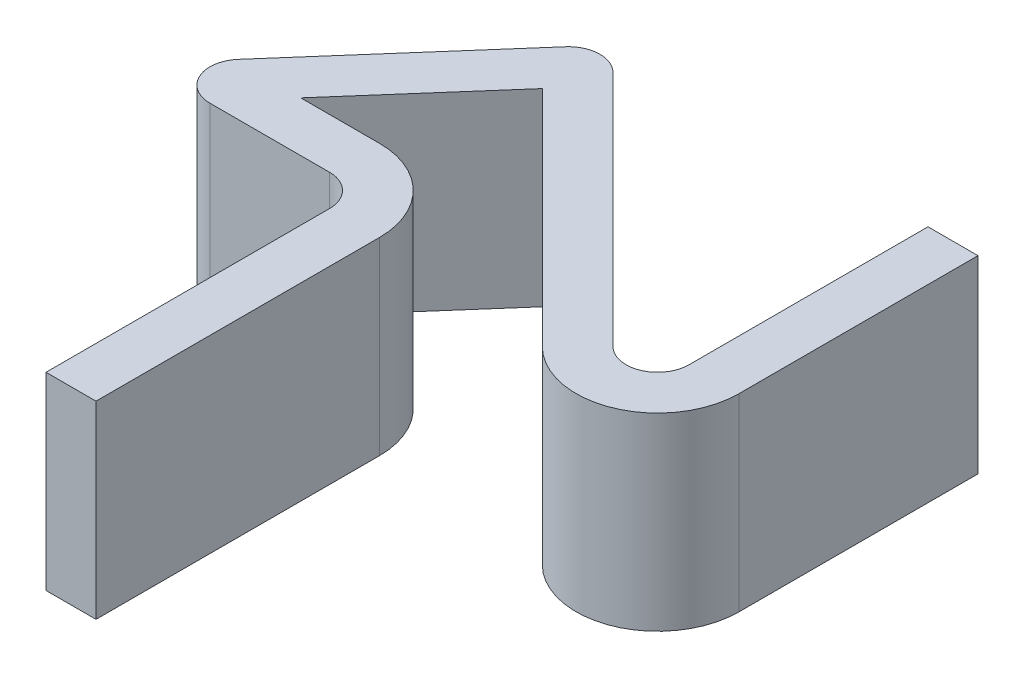
ISO-10303-21;
HEADER;
FILE_DESCRIPTION(('STEP AP214'),'2;1');
FILE_NAME('part.step','',(''),(''),'','','');
FILE_SCHEMA(('AUTOMOTIVE_DESIGN { 1 0 10303 214 1 1 1 1 }'));
ENDSEC;
DATA;
#1=APPLICATION_CONTEXT('core data for automotive mechanical design processes');
#2=APPLICATION_PROTOCOL_DEFINITION('international standard','automotive_design',2000,#1);
#3=PRODUCT_CONTEXT('',#1,'mechanical');
#4=PRODUCT('Part','Part','',(#3));
#5=PRODUCT_RELATED_PRODUCT_CATEGORY('part','',(#4));
#6=PRODUCT_DEFINITION_FORMATION('','',#4);
#7=PRODUCT_DEFINITION_CONTEXT('part definition',#1,'design');
#8=PRODUCT_DEFINITION('design','',#6,#7);
#9=PRODUCT_DEFINITION_SHAPE('','',#8);
#10=(LENGTH_UNIT() NAMED_UNIT(*) SI_UNIT(.MILLI.,.METRE.));
#11=(NAMED_UNIT(*) PLANE_ANGLE_UNIT() SI_UNIT($,.RADIAN.));
#12=(NAMED_UNIT(*) SI_UNIT($,.STERADIAN.) SOLID_ANGLE_UNIT());
#13=UNCERTAINTY_MEASURE_WITH_UNIT(LENGTH_MEASURE(1.E-05),#10,'distance_accuracy_value','');
#14=(GEOMETRIC_REPRESENTATION_CONTEXT(3) GLOBAL_UNCERTAINTY_ASSIGNED_CONTEXT((#13)) GLOBAL_UNIT_ASSIGNED_CONTEXT((#10,
#11,#12)) REPRESENTATION_CONTEXT('',''));
#15=CARTESIAN_POINT('',(0.,0.,0.));
#16=DIRECTION('',(0.,0.,1.));
#17=DIRECTION('',(1.,0.,0.));
#18=AXIS2_PLACEMENT_3D('',#15,#16,#17);
#19=CARTESIAN_POINT('',(0.,1.5,0.));
#20=DIRECTION('',(0.,0.,-1.));
#21=DIRECTION('',(-1.,0.,0.));
#22=AXIS2_PLACEMENT_3D('',#19,#20,#21);
#23=PLANE('',#22);
#24=DIRECTION('',(1.,0.,0.));
#25=VECTOR('',#24,1.);
#26=CARTESIAN_POINT('',(0.,-1.5,0.));
#27=LINE('',#26,#25);
#28=CARTESIAN_POINT('',(0.,-1.5,0.));
#29=VERTEX_POINT('',#28);
#30=CARTESIAN_POINT('',(0.79375,-1.5,0.));
#31=VERTEX_POINT('',#30);
#32=EDGE_CURVE('E200',#29,#31,#27,.T.);
#33=ORIENTED_EDGE('',*,*,#32,.T.);
#34=DIRECTION('',(0.,-1.,0.));
#35=VECTOR('',#34,1.);
#36=CARTESIAN_POINT('',(0.79375,1.5,0.));
#37=LINE('',#36,#35);
#38=CARTESIAN_POINT('',(0.79375,1.5,0.));
#39=VERTEX_POINT('',#38);
#40=EDGE_CURVE('E11',#39,#31,#37,.T.);
#41=ORIENTED_EDGE('',*,*,#40,.F.);
#42=DIRECTION('',(1.,0.,0.));
#43=VECTOR('',#42,1.);
#44=CARTESIAN_POINT('',(0.,1.5,0.));
#45=LINE('',#44,#43);
#46=CARTESIAN_POINT('',(0.,1.5,0.));
#47=VERTEX_POINT('',#46);
#48=EDGE_CURVE('E252',#47,#39,#45,.T.);
#49=ORIENTED_EDGE('',*,*,#48,.F.);
#50=DIRECTION('',(0.,-1.,0.));
#51=VECTOR('',#50,1.);
#52=CARTESIAN_POINT('',(0.,1.5,0.));
#53=LINE('',#52,#51);
#54=EDGE_CURVE('E196',#47,#29,#53,.T.);
#55=ORIENTED_EDGE('',*,*,#54,.T.);
#56=EDGE_LOOP('',(#33,#41,#49,#55));
#57=FACE_BOUND('',#56,.T.);
#58=ADVANCED_FACE('F39',(#57),#23,.F.);
#59=CARTESIAN_POINT('',(0.79375,1.5,0.));
#60=DIRECTION('',(-1.,0.,0.));
#61=DIRECTION('',(0.,0.,1.));
#62=AXIS2_PLACEMENT_3D('',#59,#60,#61);
#63=PLANE('',#62);
#64=DIRECTION('',(0.,0.,-1.));
#65=VECTOR('',#64,1.);
#66=CARTESIAN_POINT('',(0.79375,-1.5,0.));
#67=LINE('',#66,#65);
#68=CARTESIAN_POINT('',(0.793750000000001,-1.5,-4.5));
#69=VERTEX_POINT('',#68);
#70=EDGE_CURVE('E204',#31,#69,#67,.T.);
#71=ORIENTED_EDGE('',*,*,#70,.T.);
#72=DIRECTION('',(0.,-1.,0.));
#73=VECTOR('',#72,1.);
#74=CARTESIAN_POINT('',(0.793750000000001,1.5,-4.5));
#75=LINE('',#74,#73);
#76=CARTESIAN_POINT('',(0.793750000000001,1.5,-4.5));
#77=VERTEX_POINT('',#76);
#78=EDGE_CURVE('E48',#77,#69,#75,.T.);
#79=ORIENTED_EDGE('',*,*,#78,.F.);
#80=DIRECTION('',(0.,0.,-1.));
#81=VECTOR('',#80,1.);
#82=CARTESIAN_POINT('',(0.79375,1.5,0.));
#83=LINE('',#82,#81);
#84=EDGE_CURVE('E129',#39,#77,#83,.T.);
#85=ORIENTED_EDGE('',*,*,#84,.F.);
#86=ORIENTED_EDGE('',*,*,#40,.T.);
#87=EDGE_LOOP('',(#71,#79,#85,#86));
#88=FACE_BOUND('',#87,.T.);
#89=ADVANCED_FACE('F388',(#88),#63,.F.);
#90=CARTESIAN_POINT('',(-0.5,1.5,-4.5));
#91=DIRECTION('',(0.,-1.,0.));
#92=DIRECTION('',(0.,0.,-1.));
#93=AXIS2_PLACEMENT_3D('',#90,#91,#92);
#94=CYLINDRICAL_SURFACE('',#93,1.29375);
#95=CARTESIAN_POINT('',(-0.5,-1.5,-4.5));
#96=DIRECTION('',(0.,1.,0.));
#97=DIRECTION('',(0.,0.,1.));
#98=AXIS2_PLACEMENT_3D('',#95,#96,#97);
#99=CIRCLE('',#98,1.29375);
#100=CARTESIAN_POINT('',(-0.5,-1.5,-5.79375));
#101=VERTEX_POINT('',#100);
#102=EDGE_CURVE('E207',#69,#101,#99,.T.);
#103=ORIENTED_EDGE('',*,*,#102,.T.);
#104=DIRECTION('',(0.,-1.,0.));
#105=VECTOR('',#104,1.);
#106=CARTESIAN_POINT('',(-0.5,1.5,-5.79375));
#107=LINE('',#106,#105);
#108=CARTESIAN_POINT('',(-0.5,1.5,-5.79375));
#109=VERTEX_POINT('',#108);
#110=EDGE_CURVE('E303',#109,#101,#107,.T.);
#111=ORIENTED_EDGE('',*,*,#110,.F.);
#112=CARTESIAN_POINT('',(-0.5,1.5,-4.5));
#113=DIRECTION('',(0.,1.,0.));
#114=DIRECTION('',(0.,0.,1.));
#115=AXIS2_PLACEMENT_3D('',#112,#113,#114);
#116=CIRCLE('',#115,1.29375);
#117=EDGE_CURVE('E313',#77,#109,#116,.T.);
#118=ORIENTED_EDGE('',*,*,#117,.F.);
#119=ORIENTED_EDGE('',*,*,#78,.T.);
#120=EDGE_LOOP('',(#103,#111,#118,#119));
#121=FACE_BOUND('',#120,.T.);
#122=ADVANCED_FACE('F311',(#121),#94,.T.);
#123=CARTESIAN_POINT('',(-0.5,1.5,-5.79375));
#124=DIRECTION('',(0.,0.,1.));
#125=DIRECTION('',(1.,0.,0.));
#126=AXIS2_PLACEMENT_3D('',#123,#124,#125);
#127=PLANE('',#126);
#128=DIRECTION('',(-1.,0.,0.));
#129=VECTOR('',#128,1.);
#130=CARTESIAN_POINT('',(-0.5,-1.5,-5.79375));
#131=LINE('',#130,#129);
#132=CARTESIAN_POINT('',(-1.75075897014273,-1.5,-5.79375));
#133=VERTEX_POINT('',#132);
#134=EDGE_CURVE('E210',#101,#133,#131,.T.);
#135=ORIENTED_EDGE('',*,*,#134,.T.);
#136=DIRECTION('',(0.,-1.,0.));
#137=VECTOR('',#136,1.);
#138=CARTESIAN_POINT('',(-1.75075897014273,1.5,-5.79375));
#139=LINE('',#138,#137);
#140=CARTESIAN_POINT('',(-1.75075897014273,1.5,-5.79375));
#141=VERTEX_POINT('',#140);
#142=EDGE_CURVE('E299',#141,#133,#139,.T.);
#143=ORIENTED_EDGE('',*,*,#142,.F.);
#144=DIRECTION('',(-1.,0.,0.));
#145=VECTOR('',#144,1.);
#146=CARTESIAN_POINT('',(-0.5,1.5,-5.79375));
#147=LINE('',#146,#145);
#148=EDGE_CURVE('E332',#109,#141,#147,.T.);
#149=ORIENTED_EDGE('',*,*,#148,.F.);
#150=ORIENTED_EDGE('',*,*,#110,.T.);
#151=EDGE_LOOP('',(#135,#143,#149,#150));
#152=FACE_BOUND('',#151,.T.);
#153=ADVANCED_FACE('F322',(#152),#127,.F.);
#154=CARTESIAN_POINT('',(-1.75075897014273,1.5,-5.79375));
#155=DIRECTION('',(-0.752576694706878,0.,-0.658504607868518));
#156=DIRECTION('',(-0.658504607868518,0.,0.752576694706878));
#157=AXIS2_PLACEMENT_3D('',#154,#155,#156);
#158=PLANE('',#157);
#159=DIRECTION('',(0.658504607868518,0.,-0.752576694706878));
#160=VECTOR('',#159,1.);
#161=CARTESIAN_POINT('',(-1.75075897014273,-1.5,-5.79375));
#162=LINE('',#161,#160);
#163=CARTESIAN_POINT('',(0.0386636088615076,-1.5,-7.83880437600485));
#164=VERTEX_POINT('',#163);
#165=EDGE_CURVE('E213',#133,#164,#162,.T.);
#166=ORIENTED_EDGE('',*,*,#165,.T.);
#167=DIRECTION('',(0.,-1.,0.));
#168=VECTOR('',#167,1.);
#169=CARTESIAN_POINT('',(0.0386636088615076,1.5,-7.83880437600485));
#170=LINE('',#169,#168);
#171=CARTESIAN_POINT('',(0.0386636088615076,1.5,-7.83880437600485));
#172=VERTEX_POINT('',#171);
#173=EDGE_CURVE('E295',#172,#164,#170,.T.);
#174=ORIENTED_EDGE('',*,*,#173,.F.);
#175=DIRECTION('',(0.658504607868518,0.,-0.752576694706878));
#176=VECTOR('',#175,1.);
#177=CARTESIAN_POINT('',(-1.75075897014273,1.5,-5.79375));
#178=LINE('',#177,#176);
#179=EDGE_CURVE('E328',#141,#172,#178,.T.);
#180=ORIENTED_EDGE('',*,*,#179,.F.);
#181=ORIENTED_EDGE('',*,*,#142,.T.);
#182=EDGE_LOOP('',(#166,#174,#180,#181));
#183=FACE_BOUND('',#182,.T.);
#184=ADVANCED_FACE('F326',(#183),#158,.F.);
#185=CARTESIAN_POINT('',(0.0386636088615076,1.5,-7.83880437600485));
#186=DIRECTION('',(0.707106781186548,0.,-0.707106781186547));
#187=DIRECTION('',(-0.707106781186547,0.,-0.707106781186548));
#188=AXIS2_PLACEMENT_3D('',#185,#186,#187);
#189=PLANE('',#188);
#190=DIRECTION('',(0.707106781186547,0.,0.707106781186548));
#191=VECTOR('',#190,1.);
#192=CARTESIAN_POINT('',(0.0386636088615076,-1.5,-7.83880437600485));
#193=LINE('',#192,#191);
#194=CARTESIAN_POINT('',(3.5851806018399,-1.5,-4.29228738302645));
#195=VERTEX_POINT('',#194);
#196=EDGE_CURVE('E216',#164,#195,#193,.T.);
#197=ORIENTED_EDGE('',*,*,#196,.T.);
#198=DIRECTION('',(0.,-1.,0.));
#199=VECTOR('',#198,1.);
#200=CARTESIAN_POINT('',(3.5851806018399,1.5,-4.29228738302645));
#201=LINE('',#200,#199);
#202=CARTESIAN_POINT('',(3.5851806018399,1.5,-4.29228738302645));
#203=VERTEX_POINT('',#202);
#204=EDGE_CURVE('E291',#203,#195,#201,.T.);
#205=ORIENTED_EDGE('',*,*,#204,.F.);
#206=DIRECTION('',(0.707106781186547,0.,0.707106781186548));
#207=VECTOR('',#206,1.);
#208=CARTESIAN_POINT('',(0.0386636088615076,1.5,-7.83880437600485));
#209=LINE('',#208,#207);
#210=EDGE_CURVE('E331',#172,#203,#209,.T.);
#211=ORIENTED_EDGE('',*,*,#210,.F.);
#212=ORIENTED_EDGE('',*,*,#173,.T.);
#213=EDGE_LOOP('',(#197,#205,#211,#212));
#214=FACE_BOUND('',#213,.T.);
#215=ADVANCED_FACE('F401',(#214),#189,.F.);
#216=CARTESIAN_POINT('',(4.5,1.5,-5.20710678118655));
#217=DIRECTION('',(0.,-1.,0.));
#218=DIRECTION('',(0.,0.,-1.));
#219=AXIS2_PLACEMENT_3D('',#216,#217,#218);
#220=CYLINDRICAL_SURFACE('',#219,1.29375);
#221=CARTESIAN_POINT('',(4.5,-1.5,-5.20710678118655));
#222=DIRECTION('',(0.,1.,0.));
#223=DIRECTION('',(0.,0.,1.));
#224=AXIS2_PLACEMENT_3D('',#221,#222,#223);
#225=CIRCLE('',#224,1.29375);
#226=CARTESIAN_POINT('',(5.79375,-1.5,-5.20710678118654));
#227=VERTEX_POINT('',#226);
#228=EDGE_CURVE('E219',#195,#227,#225,.T.);
#229=ORIENTED_EDGE('',*,*,#228,.T.);
#230=DIRECTION('',(0.,-1.,0.));
#231=VECTOR('',#230,1.);
#232=CARTESIAN_POINT('',(5.79375,1.5,-5.20710678118654));
#233=LINE('',#232,#231);
#234=CARTESIAN_POINT('',(5.79375,1.5,-5.20710678118654));
#235=VERTEX_POINT('',#234);
#236=EDGE_CURVE('E287',#235,#227,#233,.T.);
#237=ORIENTED_EDGE('',*,*,#236,.F.);
#238=CARTESIAN_POINT('',(4.5,1.5,-5.20710678118655));
#239=DIRECTION('',(0.,1.,0.));
#240=DIRECTION('',(0.,0.,1.));
#241=AXIS2_PLACEMENT_3D('',#238,#239,#240);
#242=CIRCLE('',#241,1.29375);
#243=EDGE_CURVE('E336',#203,#235,#242,.T.);
#244=ORIENTED_EDGE('',*,*,#243,.F.);
#245=ORIENTED_EDGE('',*,*,#204,.T.);
#246=EDGE_LOOP('',(#229,#237,#244,#245));
#247=FACE_BOUND('',#246,.T.);
#248=ADVANCED_FACE('F404',(#247),#220,.T.);
#249=CARTESIAN_POINT('',(5.79375,1.5,-5.20710678118654));
#250=DIRECTION('',(-1.,0.,0.));
#251=DIRECTION('',(0.,0.,1.));
#252=AXIS2_PLACEMENT_3D('',#249,#250,#251);
#253=PLANE('',#252);
#254=DIRECTION('',(0.,0.,-1.));
#255=VECTOR('',#254,1.);
#256=CARTESIAN_POINT('',(5.79375,-1.5,-5.20710678118654));
#257=LINE('',#256,#255);
#258=CARTESIAN_POINT('',(5.79375,-1.5,-9.));
#259=VERTEX_POINT('',#258);
#260=EDGE_CURVE('E222',#227,#259,#257,.T.);
#261=ORIENTED_EDGE('',*,*,#260,.T.);
#262=DIRECTION('',(0.,-1.,0.));
#263=VECTOR('',#262,1.);
#264=CARTESIAN_POINT('',(5.79375,1.5,-9.));
#265=LINE('',#264,#263);
#266=CARTESIAN_POINT('',(5.79375,1.5,-9.));
#267=VERTEX_POINT('',#266);
#268=EDGE_CURVE('E283',#267,#259,#265,.T.);
#269=ORIENTED_EDGE('',*,*,#268,.F.);
#270=DIRECTION('',(0.,0.,-1.));
#271=VECTOR('',#270,1.);
#272=CARTESIAN_POINT('',(5.79375,1.5,-5.20710678118654));
#273=LINE('',#272,#271);
#274=EDGE_CURVE('E343',#235,#267,#273,.T.);
#275=ORIENTED_EDGE('',*,*,#274,.F.);
#276=ORIENTED_EDGE('',*,*,#236,.T.);
#277=EDGE_LOOP('',(#261,#269,#275,#276));
#278=FACE_BOUND('',#277,.T.);
#279=ADVANCED_FACE('F408',(#278),#253,.F.);
#280=CARTESIAN_POINT('',(5.,1.5,-9.));
#281=DIRECTION('',(0.,0.,1.));
#282=DIRECTION('',(1.,0.,0.));
#283=AXIS2_PLACEMENT_3D('',#280,#281,#282);
#284=PLANE('',#283);
#285=DIRECTION('',(-1.,0.,0.));
#286=VECTOR('',#285,1.);
#287=CARTESIAN_POINT('',(5.,-1.5,-9.));
#288=LINE('',#287,#286);
#289=CARTESIAN_POINT('',(5.,-1.5,-9.));
#290=VERTEX_POINT('',#289);
#291=EDGE_CURVE('E225',#259,#290,#288,.T.);
#292=ORIENTED_EDGE('',*,*,#291,.T.);
#293=DIRECTION('',(0.,-1.,0.));
#294=VECTOR('',#293,1.);
#295=CARTESIAN_POINT('',(5.,1.5,-9.));
#296=LINE('',#295,#294);
#297=CARTESIAN_POINT('',(5.,1.5,-9.));
#298=VERTEX_POINT('',#297);
#299=EDGE_CURVE('E279',#298,#290,#296,.T.);
#300=ORIENTED_EDGE('',*,*,#299,.F.);
#301=DIRECTION('',(-1.,0.,0.));
#302=VECTOR('',#301,1.);
#303=CARTESIAN_POINT('',(5.,1.5,-9.));
#304=LINE('',#303,#302);
#305=EDGE_CURVE('E346',#267,#298,#304,.T.);
#306=ORIENTED_EDGE('',*,*,#305,.F.);
#307=ORIENTED_EDGE('',*,*,#268,.T.);
#308=EDGE_LOOP('',(#292,#300,#306,#307));
#309=FACE_BOUND('',#308,.T.);
#310=ADVANCED_FACE('F412',(#309),#284,.F.);
#311=CARTESIAN_POINT('',(5.,1.5,-5.20710678118655));
#312=DIRECTION('',(1.,0.,0.));
#313=DIRECTION('',(0.,0.,-1.));
#314=AXIS2_PLACEMENT_3D('',#311,#312,#313);
#315=PLANE('',#314);
#316=DIRECTION('',(0.,0.,1.));
#317=VECTOR('',#316,1.);
#318=CARTESIAN_POINT('',(5.,-1.5,-5.20710678118655));
#319=LINE('',#318,#317);
#320=CARTESIAN_POINT('',(5.,-1.5,-5.20710678118655));
#321=VERTEX_POINT('',#320);
#322=EDGE_CURVE('E228',#290,#321,#319,.T.);
#323=ORIENTED_EDGE('',*,*,#322,.T.);
#324=DIRECTION('',(0.,-1.,0.));
#325=VECTOR('',#324,1.);
#326=CARTESIAN_POINT('',(5.,1.5,-5.20710678118655));
#327=LINE('',#326,#325);
#328=CARTESIAN_POINT('',(5.,1.5,-5.20710678118655));
#329=VERTEX_POINT('',#328);
#330=EDGE_CURVE('E275',#329,#321,#327,.T.);
#331=ORIENTED_EDGE('',*,*,#330,.F.);
#332=DIRECTION('',(0.,0.,1.));
#333=VECTOR('',#332,1.);
#334=CARTESIAN_POINT('',(5.,1.5,-5.20710678118655));
#335=LINE('',#334,#333);
#336=EDGE_CURVE('E349',#298,#329,#335,.T.);
#337=ORIENTED_EDGE('',*,*,#336,.F.);
#338=ORIENTED_EDGE('',*,*,#299,.T.);
#339=EDGE_LOOP('',(#323,#331,#337,#338));
#340=FACE_BOUND('',#339,.T.);
#341=ADVANCED_FACE('F416',(#340),#315,.F.);
#342=CARTESIAN_POINT('',(4.5,1.5,-5.20710678118655));
#343=DIRECTION('',(0.,-1.,0.));
#344=DIRECTION('',(0.,0.,-1.));
#345=AXIS2_PLACEMENT_3D('',#342,#343,#344);
#346=CYLINDRICAL_SURFACE('',#345,0.5);
#347=CARTESIAN_POINT('',(4.5,-1.5,-5.20710678118655));
#348=DIRECTION('',(0.,-1.,0.));
#349=DIRECTION('',(0.,0.,1.));
#350=AXIS2_PLACEMENT_3D('',#347,#348,#349);
#351=CIRCLE('',#350,0.5);
#352=CARTESIAN_POINT('',(4.14644660940673,-1.5,-4.85355339059327));
#353=VERTEX_POINT('',#352);
#354=EDGE_CURVE('E231',#321,#353,#351,.T.);
#355=ORIENTED_EDGE('',*,*,#354,.T.);
#356=DIRECTION('',(0.,-1.,0.));
#357=VECTOR('',#356,1.);
#358=CARTESIAN_POINT('',(4.14644660940673,1.5,-4.85355339059327));
#359=LINE('',#358,#357);
#360=CARTESIAN_POINT('',(4.14644660940673,1.5,-4.85355339059327));
#361=VERTEX_POINT('',#360);
#362=EDGE_CURVE('E271',#361,#353,#359,.T.);
#363=ORIENTED_EDGE('',*,*,#362,.F.);
#364=CARTESIAN_POINT('',(4.5,1.5,-5.20710678118655));
#365=DIRECTION('',(0.,-1.,0.));
#366=DIRECTION('',(0.,0.,1.));
#367=AXIS2_PLACEMENT_3D('',#364,#365,#366);
#368=CIRCLE('',#367,0.5);
#369=EDGE_CURVE('E352',#329,#361,#368,.T.);
#370=ORIENTED_EDGE('',*,*,#369,.F.);
#371=ORIENTED_EDGE('',*,*,#330,.T.);
#372=EDGE_LOOP('',(#355,#363,#370,#371));
#373=FACE_BOUND('',#372,.T.);
#374=ADVANCED_FACE('F420',(#373),#346,.F.);
#375=CARTESIAN_POINT('',(0.377908419797371,1.5,-8.62209158020262));
#376=DIRECTION('',(-0.707106781186547,0.,0.707106781186548));
#377=DIRECTION('',(0.707106781186548,0.,0.707106781186547));
#378=AXIS2_PLACEMENT_3D('',#375,#376,#377);
#379=PLANE('',#378);
#380=DIRECTION('',(-0.707106781186548,0.,-0.707106781186547));
#381=VECTOR('',#380,1.);
#382=CARTESIAN_POINT('',(0.377908419797371,-1.5,-8.62209158020262));
#383=LINE('',#382,#381);
#384=CARTESIAN_POINT('',(0.377908419797372,-1.5,-8.62209158020262));
#385=VERTEX_POINT('',#384);
#386=EDGE_CURVE('E234',#353,#385,#383,.T.);
#387=ORIENTED_EDGE('',*,*,#386,.T.);
#388=DIRECTION('',(0.,-1.,0.));
#389=VECTOR('',#388,1.);
#390=CARTESIAN_POINT('',(0.377908419797372,1.5,-8.62209158020262));
#391=LINE('',#390,#389);
#392=CARTESIAN_POINT('',(0.377908419797372,1.5,-8.62209158020262));
#393=VERTEX_POINT('',#392);
#394=EDGE_CURVE('E267',#393,#385,#391,.T.);
#395=ORIENTED_EDGE('',*,*,#394,.F.);
#396=DIRECTION('',(-0.707106781186548,0.,-0.707106781186547));
#397=VECTOR('',#396,1.);
#398=CARTESIAN_POINT('',(0.377908419797371,1.5,-8.62209158020262));
#399=LINE('',#398,#397);
#400=EDGE_CURVE('E355',#361,#393,#399,.T.);
#401=ORIENTED_EDGE('',*,*,#400,.F.);
#402=ORIENTED_EDGE('',*,*,#362,.T.);
#403=EDGE_LOOP('',(#387,#395,#401,#402));
#404=FACE_BOUND('',#403,.T.);
#405=ADVANCED_FACE('F424',(#404),#379,.F.);
#406=CARTESIAN_POINT('',(0.0243550292040987,1.5,-8.26853818960935));
#407=DIRECTION('',(0.,-1.,0.));
#408=DIRECTION('',(0.,0.,-1.));
#409=AXIS2_PLACEMENT_3D('',#406,#407,#408);
#410=CYLINDRICAL_SURFACE('',#409,0.499999999999999);
#411=CARTESIAN_POINT('',(0.0243550292040987,-1.5,-8.26853818960935));
#412=DIRECTION('',(0.,1.,0.));
#413=DIRECTION('',(0.,0.,-1.));
#414=AXIS2_PLACEMENT_3D('',#411,#412,#413);
#415=CIRCLE('',#414,0.499999999999999);
#416=CARTESIAN_POINT('',(-0.35193331814934,-1.5,-8.59779049354361));
#417=VERTEX_POINT('',#416);
#418=EDGE_CURVE('E237',#385,#417,#415,.T.);
#419=ORIENTED_EDGE('',*,*,#418,.T.);
#420=DIRECTION('',(0.,-1.,0.));
#421=VECTOR('',#420,1.);
#422=CARTESIAN_POINT('',(-0.35193331814934,1.5,-8.59779049354361));
#423=LINE('',#422,#421);
#424=CARTESIAN_POINT('',(-0.35193331814934,1.5,-8.59779049354361));
#425=VERTEX_POINT('',#424);
#426=EDGE_CURVE('E263',#425,#417,#423,.T.);
#427=ORIENTED_EDGE('',*,*,#426,.F.);
#428=CARTESIAN_POINT('',(0.0243550292040987,1.5,-8.26853818960935));
#429=DIRECTION('',(0.,1.,0.));
#430=DIRECTION('',(0.,0.,-1.));
#431=AXIS2_PLACEMENT_3D('',#428,#429,#430);
#432=CIRCLE('',#431,0.499999999999999);
#433=EDGE_CURVE('E358',#393,#425,#432,.T.);
#434=ORIENTED_EDGE('',*,*,#433,.F.);
#435=ORIENTED_EDGE('',*,*,#394,.T.);
#436=EDGE_LOOP('',(#419,#427,#434,#435));
#437=FACE_BOUND('',#436,.T.);
#438=ADVANCED_FACE('F428',(#437),#410,.T.);
#439=CARTESIAN_POINT('',(-2.77440423405752,1.5,-5.82925230393426));
#440=DIRECTION('',(0.752576694706878,0.,0.658504607868518));
#441=DIRECTION('',(0.658504607868518,0.,-0.752576694706878));
#442=AXIS2_PLACEMENT_3D('',#439,#440,#441);
#443=PLANE('',#442);
#444=DIRECTION('',(-0.658504607868518,0.,0.752576694706878));
#445=VECTOR('',#444,1.);
#446=CARTESIAN_POINT('',(-2.77440423405752,-1.5,-5.82925230393426));
#447=LINE('',#446,#445);
#448=CARTESIAN_POINT('',(-2.77440423405752,-1.5,-5.82925230393426));
#449=VERTEX_POINT('',#448);
#450=EDGE_CURVE('E240',#417,#449,#447,.T.);
#451=ORIENTED_EDGE('',*,*,#450,.T.);
#452=DIRECTION('',(0.,-1.,0.));
#453=VECTOR('',#452,1.);
#454=CARTESIAN_POINT('',(-2.77440423405752,1.5,-5.82925230393426));
#455=LINE('',#454,#453);
#456=CARTESIAN_POINT('',(-2.77440423405752,1.5,-5.82925230393426));
#457=VERTEX_POINT('',#456);
#458=EDGE_CURVE('E259',#457,#449,#455,.T.);
#459=ORIENTED_EDGE('',*,*,#458,.F.);
#460=DIRECTION('',(-0.658504607868518,0.,0.752576694706878));
#461=VECTOR('',#460,1.);
#462=CARTESIAN_POINT('',(-2.77440423405752,1.5,-5.82925230393426));
#463=LINE('',#462,#461);
#464=EDGE_CURVE('E361',#425,#457,#463,.T.);
#465=ORIENTED_EDGE('',*,*,#464,.F.);
#466=ORIENTED_EDGE('',*,*,#426,.T.);
#467=EDGE_LOOP('',(#451,#459,#465,#466));
#468=FACE_BOUND('',#467,.T.);
#469=ADVANCED_FACE('F369',(#468),#443,.F.);
#470=CARTESIAN_POINT('',(-2.39811588670409,1.5,-5.5));
#471=DIRECTION('',(0.,-1.,0.));
#472=DIRECTION('',(0.,0.,-1.));
#473=AXIS2_PLACEMENT_3D('',#470,#471,#472);
#474=CYLINDRICAL_SURFACE('',#473,0.499999999999999);
#475=CARTESIAN_POINT('',(-2.39811588670409,-1.5,-5.5));
#476=DIRECTION('',(0.,1.,0.));
#477=DIRECTION('',(0.,0.,1.));
#478=AXIS2_PLACEMENT_3D('',#475,#476,#477);
#479=CIRCLE('',#478,0.499999999999999);
#480=CARTESIAN_POINT('',(-2.39811588670409,-1.5,-5.));
#481=VERTEX_POINT('',#480);
#482=EDGE_CURVE('E243',#449,#481,#479,.T.);
#483=ORIENTED_EDGE('',*,*,#482,.T.);
#484=DIRECTION('',(0.,-1.,0.));
#485=VECTOR('',#484,1.);
#486=CARTESIAN_POINT('',(-2.39811588670409,1.5,-5.));
#487=LINE('',#486,#485);
#488=CARTESIAN_POINT('',(-2.39811588670409,1.5,-5.));
#489=VERTEX_POINT('',#488);
#490=EDGE_CURVE('E189',#489,#481,#487,.T.);
#491=ORIENTED_EDGE('',*,*,#490,.F.);
#492=CARTESIAN_POINT('',(-2.39811588670409,1.5,-5.5));
#493=DIRECTION('',(0.,1.,0.));
#494=DIRECTION('',(0.,0.,1.));
#495=AXIS2_PLACEMENT_3D('',#492,#493,#494);
#496=CIRCLE('',#495,0.499999999999999);
#497=EDGE_CURVE('E178',#457,#489,#496,.T.);
#498=ORIENTED_EDGE('',*,*,#497,.F.);
#499=ORIENTED_EDGE('',*,*,#458,.T.);
#500=EDGE_LOOP('',(#483,#491,#498,#499));
#501=FACE_BOUND('',#500,.T.);
#502=ADVANCED_FACE('F373',(#501),#474,.T.);
#503=CARTESIAN_POINT('',(-0.5,1.5,-5.));
#504=DIRECTION('',(0.,0.,-1.));
#505=DIRECTION('',(-1.,0.,0.));
#506=AXIS2_PLACEMENT_3D('',#503,#504,#505);
#507=PLANE('',#506);
#508=DIRECTION('',(1.,0.,0.));
#509=VECTOR('',#508,1.);
#510=CARTESIAN_POINT('',(-0.5,-1.5,-5.));
#511=LINE('',#510,#509);
#512=CARTESIAN_POINT('',(-0.5,-1.5,-5.));
#513=VERTEX_POINT('',#512);
#514=EDGE_CURVE('E187',#481,#513,#511,.T.);
#515=ORIENTED_EDGE('',*,*,#514,.T.);
#516=DIRECTION('',(0.,-1.,0.));
#517=VECTOR('',#516,1.);
#518=CARTESIAN_POINT('',(-0.5,1.5,-5.));
#519=LINE('',#518,#517);
#520=CARTESIAN_POINT('',(-0.5,1.5,-5.));
#521=VERTEX_POINT('',#520);
#522=EDGE_CURVE('E184',#521,#513,#519,.T.);
#523=ORIENTED_EDGE('',*,*,#522,.F.);
#524=DIRECTION('',(1.,0.,0.));
#525=VECTOR('',#524,1.);
#526=CARTESIAN_POINT('',(-0.5,1.5,-5.));
#527=LINE('',#526,#525);
#528=EDGE_CURVE('E172',#489,#521,#527,.T.);
#529=ORIENTED_EDGE('',*,*,#528,.F.);
#530=ORIENTED_EDGE('',*,*,#490,.T.);
#531=EDGE_LOOP('',(#515,#523,#529,#530));
#532=FACE_BOUND('',#531,.T.);
#533=ADVANCED_FACE('F185',(#532),#507,.F.);
#534=CARTESIAN_POINT('',(-0.5,1.5,-4.5));
#535=DIRECTION('',(0.,-1.,0.));
#536=DIRECTION('',(0.,0.,-1.));
#537=AXIS2_PLACEMENT_3D('',#534,#535,#536);
#538=CYLINDRICAL_SURFACE('',#537,0.5);
#539=CARTESIAN_POINT('',(-0.5,-1.5,-4.5));
#540=DIRECTION('',(0.,-1.,0.));
#541=DIRECTION('',(0.,0.,1.));
#542=AXIS2_PLACEMENT_3D('',#539,#540,#541);
#543=CIRCLE('',#542,0.5);
#544=CARTESIAN_POINT('',(0.,-1.5,-4.5));
#545=VERTEX_POINT('',#544);
#546=EDGE_CURVE('E115',#513,#545,#543,.T.);
#547=ORIENTED_EDGE('',*,*,#546,.T.);
#548=DIRECTION('',(0.,-1.,0.));
#549=VECTOR('',#548,1.);
#550=CARTESIAN_POINT('',(0.,1.5,-4.5));
#551=LINE('',#550,#549);
#552=CARTESIAN_POINT('',(0.,1.5,-4.5));
#553=VERTEX_POINT('',#552);
#554=EDGE_CURVE('E190',#553,#545,#551,.T.);
#555=ORIENTED_EDGE('',*,*,#554,.F.);
#556=CARTESIAN_POINT('',(-0.5,1.5,-4.5));
#557=DIRECTION('',(0.,-1.,0.));
#558=DIRECTION('',(0.,0.,1.));
#559=AXIS2_PLACEMENT_3D('',#556,#557,#558);
#560=CIRCLE('',#559,0.5);
#561=EDGE_CURVE('E176',#521,#553,#560,.T.);
#562=ORIENTED_EDGE('',*,*,#561,.F.);
#563=ORIENTED_EDGE('',*,*,#522,.T.);
#564=EDGE_LOOP('',(#547,#555,#562,#563));
#565=FACE_BOUND('',#564,.T.);
#566=ADVANCED_FACE('F192',(#565),#538,.F.);
#567=CARTESIAN_POINT('',(0.,1.5,0.));
#568=DIRECTION('',(1.,0.,0.));
#569=DIRECTION('',(0.,0.,-1.));
#570=AXIS2_PLACEMENT_3D('',#567,#568,#569);
#571=PLANE('',#570);
#572=DIRECTION('',(0.,0.,1.));
#573=VECTOR('',#572,1.);
#574=CARTESIAN_POINT('',(0.,-1.5,0.));
#575=LINE('',#574,#573);
#576=EDGE_CURVE('E121',#545,#29,#575,.T.);
#577=ORIENTED_EDGE('',*,*,#576,.T.);
#578=ORIENTED_EDGE('',*,*,#54,.F.);
#579=DIRECTION('',(0.,0.,1.));
#580=VECTOR('',#579,1.);
#581=CARTESIAN_POINT('',(0.,1.5,0.));
#582=LINE('',#581,#580);
#583=EDGE_CURVE('E56',#553,#47,#582,.T.);
#584=ORIENTED_EDGE('',*,*,#583,.F.);
#585=ORIENTED_EDGE('',*,*,#554,.T.);
#586=EDGE_LOOP('',(#577,#578,#584,#585));
#587=FACE_BOUND('',#586,.T.);
#588=ADVANCED_FACE('F377',(#587),#571,.F.);
#589=CARTESIAN_POINT('',(-0.5,1.5,-4.5));
#590=DIRECTION('',(0.,1.,0.));
#591=DIRECTION('',(0.,0.,1.));
#592=AXIS2_PLACEMENT_3D('',#589,#590,#591);
#593=PLANE('',#592);
#594=ORIENTED_EDGE('',*,*,#48,.T.);
#595=ORIENTED_EDGE('',*,*,#84,.T.);
#596=ORIENTED_EDGE('',*,*,#117,.T.);
#597=ORIENTED_EDGE('',*,*,#148,.T.);
#598=ORIENTED_EDGE('',*,*,#179,.T.);
#599=ORIENTED_EDGE('',*,*,#210,.T.);
#600=ORIENTED_EDGE('',*,*,#243,.T.);
#601=ORIENTED_EDGE('',*,*,#274,.T.);
#602=ORIENTED_EDGE('',*,*,#305,.T.);
#603=ORIENTED_EDGE('',*,*,#336,.T.);
#604=ORIENTED_EDGE('',*,*,#369,.T.);
#605=ORIENTED_EDGE('',*,*,#400,.T.);
#606=ORIENTED_EDGE('',*,*,#433,.T.);
#607=ORIENTED_EDGE('',*,*,#464,.T.);
#608=ORIENTED_EDGE('',*,*,#497,.T.);
#609=ORIENTED_EDGE('',*,*,#528,.T.);
#610=ORIENTED_EDGE('',*,*,#561,.T.);
#611=ORIENTED_EDGE('',*,*,#583,.T.);
#612=EDGE_LOOP('',(#594,#595,#596,#597,#598,#599,#600,#601,#602,#603,#604,#605,#606,#607,#608,
#609,#610,#611));
#613=FACE_BOUND('',#612,.T.);
#614=ADVANCED_FACE('F174',(#613),#593,.T.);
#615=CARTESIAN_POINT('',(-0.5,-1.5,-4.5));
#616=DIRECTION('',(0.,1.,0.));
#617=DIRECTION('',(0.,0.,1.));
#618=AXIS2_PLACEMENT_3D('',#615,#616,#617);
#619=PLANE('',#618);
#620=ORIENTED_EDGE('',*,*,#32,.F.);
#621=ORIENTED_EDGE('',*,*,#576,.F.);
#622=ORIENTED_EDGE('',*,*,#546,.F.);
#623=ORIENTED_EDGE('',*,*,#514,.F.);
#624=ORIENTED_EDGE('',*,*,#482,.F.);
#625=ORIENTED_EDGE('',*,*,#450,.F.);
#626=ORIENTED_EDGE('',*,*,#418,.F.);
#627=ORIENTED_EDGE('',*,*,#386,.F.);
#628=ORIENTED_EDGE('',*,*,#354,.F.);
#629=ORIENTED_EDGE('',*,*,#322,.F.);
#630=ORIENTED_EDGE('',*,*,#291,.F.);
#631=ORIENTED_EDGE('',*,*,#260,.F.);
#632=ORIENTED_EDGE('',*,*,#228,.F.);
#633=ORIENTED_EDGE('',*,*,#196,.F.);
#634=ORIENTED_EDGE('',*,*,#165,.F.);
#635=ORIENTED_EDGE('',*,*,#134,.F.);
#636=ORIENTED_EDGE('',*,*,#102,.F.);
#637=ORIENTED_EDGE('',*,*,#70,.F.);
#638=EDGE_LOOP('',(#620,#621,#622,#623,#624,#625,#626,#627,#628,#629,#630,#631,#632,#633,#634,
#635,#636,#637));
#639=FACE_BOUND('',#638,.T.);
#640=ADVANCED_FACE('F317',(#639),#619,.F.);
#641=CLOSED_SHELL('',(#58,#89,#122,#153,#184,#215,#248,#279,#310,#341,#374,#405,#438,#469,#502,
#533,#566,#588,#614,#640));
#642=MANIFOLD_SOLID_BREP('B2',#641);
#643=ADVANCED_BREP_SHAPE_REPRESENTATION('',(#18,#642),#14);
#644=SHAPE_DEFINITION_REPRESENTATION(#9,#643);
ENDSEC;
END-ISO-10303-21;
